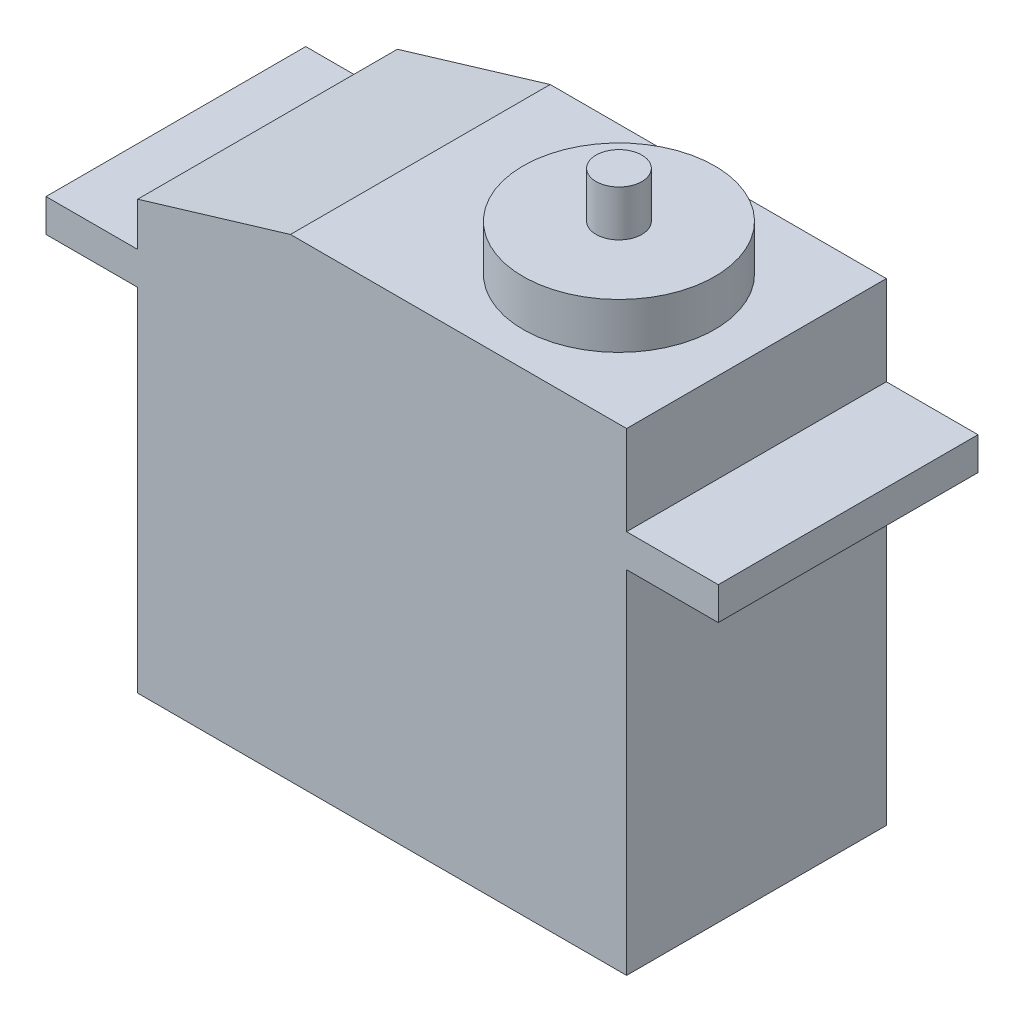
ISO-10303-21;
HEADER;
FILE_DESCRIPTION(('STEP AP214'),'2;1');
FILE_NAME('part.step','',(''),(''),'','','');
FILE_SCHEMA(('AUTOMOTIVE_DESIGN { 1 0 10303 214 1 1 1 1 }'));
ENDSEC;
DATA;
#1=APPLICATION_CONTEXT('core data for automotive mechanical design processes');
#2=APPLICATION_PROTOCOL_DEFINITION('international standard','automotive_design',2000,#1);
#3=PRODUCT_CONTEXT('',#1,'mechanical');
#4=PRODUCT('Part','Part','',(#3));
#5=PRODUCT_RELATED_PRODUCT_CATEGORY('part','',(#4));
#6=PRODUCT_DEFINITION_FORMATION('','',#4);
#7=PRODUCT_DEFINITION_CONTEXT('part definition',#1,'design');
#8=PRODUCT_DEFINITION('design','',#6,#7);
#9=PRODUCT_DEFINITION_SHAPE('','',#8);
#10=(LENGTH_UNIT() NAMED_UNIT(*) SI_UNIT(.MILLI.,.METRE.));
#11=(NAMED_UNIT(*) PLANE_ANGLE_UNIT() SI_UNIT($,.RADIAN.));
#12=(NAMED_UNIT(*) SI_UNIT($,.STERADIAN.) SOLID_ANGLE_UNIT());
#13=UNCERTAINTY_MEASURE_WITH_UNIT(LENGTH_MEASURE(1.E-05),#10,'distance_accuracy_value','');
#14=(GEOMETRIC_REPRESENTATION_CONTEXT(3) GLOBAL_UNCERTAINTY_ASSIGNED_CONTEXT((#13)) GLOBAL_UNIT_ASSIGNED_CONTEXT((#10,
#11,#12)) REPRESENTATION_CONTEXT('',''));
#15=CARTESIAN_POINT('',(0.,0.,0.));
#16=DIRECTION('',(0.,0.,1.));
#17=DIRECTION('',(1.,0.,0.));
#18=AXIS2_PLACEMENT_3D('',#15,#16,#17);
#19=CARTESIAN_POINT('',(16.,0.,-17.));
#20=DIRECTION('',(1.,0.,0.));
#21=DIRECTION('',(0.,0.,-1.));
#22=AXIS2_PLACEMENT_3D('',#19,#20,#21);
#23=PLANE('',#22);
#24=DIRECTION('',(0.,1.,0.));
#25=VECTOR('',#24,1.);
#26=CARTESIAN_POINT('',(16.,0.,-17.));
#27=LINE('',#26,#25);
#28=CARTESIAN_POINT('',(16.,-15.5,-17.));
#29=VERTEX_POINT('',#28);
#30=CARTESIAN_POINT('',(16.,7.5,-17.));
#31=VERTEX_POINT('',#30);
#32=EDGE_CURVE('E190',#29,#31,#27,.T.);
#33=ORIENTED_EDGE('',*,*,#32,.T.);
#34=DIRECTION('',(0.,0.,1.));
#35=VECTOR('',#34,1.);
#36=CARTESIAN_POINT('',(16.,7.5,-17.));
#37=LINE('',#36,#35);
#38=CARTESIAN_POINT('',(16.,7.5,0.));
#39=VERTEX_POINT('',#38);
#40=EDGE_CURVE('E166',#31,#39,#37,.T.);
#41=ORIENTED_EDGE('',*,*,#40,.T.);
#42=DIRECTION('',(0.,1.,0.));
#43=VECTOR('',#42,1.);
#44=CARTESIAN_POINT('',(16.,0.,0.));
#45=LINE('',#44,#43);
#46=CARTESIAN_POINT('',(16.,-15.5,0.));
#47=VERTEX_POINT('',#46);
#48=EDGE_CURVE('E204',#47,#39,#45,.T.);
#49=ORIENTED_EDGE('',*,*,#48,.F.);
#50=DIRECTION('',(0.,0.,1.));
#51=VECTOR('',#50,1.);
#52=CARTESIAN_POINT('',(16.,-15.5,-17.));
#53=LINE('',#52,#51);
#54=EDGE_CURVE('E215',#29,#47,#53,.T.);
#55=ORIENTED_EDGE('',*,*,#54,.F.);
#56=EDGE_LOOP('',(#33,#41,#49,#55));
#57=FACE_BOUND('',#56,.T.);
#58=ADVANCED_FACE('F39',(#57),#23,.T.);
#59=CARTESIAN_POINT('',(-16.,0.,-17.));
#60=DIRECTION('',(1.,0.,0.));
#61=DIRECTION('',(0.,0.,-1.));
#62=AXIS2_PLACEMENT_3D('',#59,#60,#61);
#63=PLANE('',#62);
#64=DIRECTION('',(0.,0.,1.));
#65=VECTOR('',#64,1.);
#66=CARTESIAN_POINT('',(-16.,7.5,-17.));
#67=LINE('',#66,#65);
#68=CARTESIAN_POINT('',(-16.,7.5,-17.));
#69=VERTEX_POINT('',#68);
#70=CARTESIAN_POINT('',(-16.,7.5,0.));
#71=VERTEX_POINT('',#70);
#72=EDGE_CURVE('E64',#69,#71,#67,.T.);
#73=ORIENTED_EDGE('',*,*,#72,.F.);
#74=DIRECTION('',(0.,1.,0.));
#75=VECTOR('',#74,1.);
#76=CARTESIAN_POINT('',(-16.,0.,-17.));
#77=LINE('',#76,#75);
#78=CARTESIAN_POINT('',(-16.,-15.5,-17.));
#79=VERTEX_POINT('',#78);
#80=EDGE_CURVE('E184',#79,#69,#77,.T.);
#81=ORIENTED_EDGE('',*,*,#80,.F.);
#82=DIRECTION('',(0.,0.,1.));
#83=VECTOR('',#82,1.);
#84=CARTESIAN_POINT('',(-16.,-15.5,-17.));
#85=LINE('',#84,#83);
#86=CARTESIAN_POINT('',(-16.,-15.5,0.));
#87=VERTEX_POINT('',#86);
#88=EDGE_CURVE('E216',#79,#87,#85,.T.);
#89=ORIENTED_EDGE('',*,*,#88,.T.);
#90=DIRECTION('',(0.,1.,0.));
#91=VECTOR('',#90,1.);
#92=CARTESIAN_POINT('',(-16.,0.,0.));
#93=LINE('',#92,#91);
#94=EDGE_CURVE('E198',#87,#71,#93,.T.);
#95=ORIENTED_EDGE('',*,*,#94,.T.);
#96=EDGE_LOOP('',(#73,#81,#89,#95));
#97=FACE_BOUND('',#96,.T.);
#98=ADVANCED_FACE('F279',(#97),#63,.F.);
#99=CARTESIAN_POINT('',(-4.76146788990826,15.8715596330275,-17.));
#100=DIRECTION('',(0.287347885566345,-0.957826285221151,0.));
#101=DIRECTION('',(0.957826285221151,0.287347885566345,0.));
#102=AXIS2_PLACEMENT_3D('',#99,#100,#101);
#103=PLANE('',#102);
#104=DIRECTION('',(0.957826285221151,0.287347885566345,0.));
#105=VECTOR('',#104,1.);
#106=CARTESIAN_POINT('',(-4.76146788990826,15.8715596330275,0.));
#107=LINE('',#106,#105);
#108=CARTESIAN_POINT('',(-16.,12.5,0.));
#109=VERTEX_POINT('',#108);
#110=CARTESIAN_POINT('',(-6.,15.5,0.));
#111=VERTEX_POINT('',#110);
#112=EDGE_CURVE('E179',#109,#111,#107,.T.);
#113=ORIENTED_EDGE('',*,*,#112,.T.);
#114=DIRECTION('',(0.,0.,1.));
#115=VECTOR('',#114,1.);
#116=CARTESIAN_POINT('',(-6.,15.5,-17.));
#117=LINE('',#116,#115);
#118=CARTESIAN_POINT('',(-6.,15.5,-17.));
#119=VERTEX_POINT('',#118);
#120=EDGE_CURVE('E209',#119,#111,#117,.T.);
#121=ORIENTED_EDGE('',*,*,#120,.F.);
#122=DIRECTION('',(0.957826285221151,0.287347885566345,0.));
#123=VECTOR('',#122,1.);
#124=CARTESIAN_POINT('',(-4.76146788990826,15.8715596330275,-17.));
#125=LINE('',#124,#123);
#126=CARTESIAN_POINT('',(-16.,12.5,-17.));
#127=VERTEX_POINT('',#126);
#128=EDGE_CURVE('E180',#127,#119,#125,.T.);
#129=ORIENTED_EDGE('',*,*,#128,.F.);
#130=DIRECTION('',(0.,0.,1.));
#131=VECTOR('',#130,1.);
#132=CARTESIAN_POINT('',(-16.,12.5,-17.));
#133=LINE('',#132,#131);
#134=EDGE_CURVE('E43',#127,#109,#133,.T.);
#135=ORIENTED_EDGE('',*,*,#134,.T.);
#136=EDGE_LOOP('',(#113,#121,#129,#135));
#137=FACE_BOUND('',#136,.T.);
#138=ADVANCED_FACE('F41',(#137),#103,.F.);
#139=CARTESIAN_POINT('',(0.,15.5,-17.));
#140=DIRECTION('',(0.,-1.,0.));
#141=DIRECTION('',(1.,0.,0.));
#142=AXIS2_PLACEMENT_3D('',#139,#140,#141);
#143=PLANE('',#142);
#144=CARTESIAN_POINT('',(7.00000000000001,15.5,-8.5));
#145=DIRECTION('',(0.,1.,0.));
#146=DIRECTION('',(-1.,0.,0.));
#147=AXIS2_PLACEMENT_3D('',#144,#145,#146);
#148=CIRCLE('',#147,6.275);
#149=CARTESIAN_POINT('',(0.725000000000003,15.5,-8.5));
#150=VERTEX_POINT('',#149);
#151=EDGE_CURVE('E48',#150,#150,#148,.T.);
#152=ORIENTED_EDGE('',*,*,#151,.F.);
#153=EDGE_LOOP('',(#152));
#154=FACE_BOUND('',#153,.T.);
#155=DIRECTION('',(1.,0.,0.));
#156=VECTOR('',#155,1.);
#157=CARTESIAN_POINT('',(0.,15.5,0.));
#158=LINE('',#157,#156);
#159=CARTESIAN_POINT('',(16.,15.5,0.));
#160=VERTEX_POINT('',#159);
#161=EDGE_CURVE('E183',#111,#160,#158,.T.);
#162=ORIENTED_EDGE('',*,*,#161,.T.);
#163=DIRECTION('',(0.,0.,1.));
#164=VECTOR('',#163,1.);
#165=CARTESIAN_POINT('',(16.,15.5,-17.));
#166=LINE('',#165,#164);
#167=CARTESIAN_POINT('',(16.,15.5,-17.));
#168=VERTEX_POINT('',#167);
#169=EDGE_CURVE('E212',#168,#160,#166,.T.);
#170=ORIENTED_EDGE('',*,*,#169,.F.);
#171=DIRECTION('',(1.,0.,0.));
#172=VECTOR('',#171,1.);
#173=CARTESIAN_POINT('',(0.,15.5,-17.));
#174=LINE('',#173,#172);
#175=EDGE_CURVE('E193',#119,#168,#174,.T.);
#176=ORIENTED_EDGE('',*,*,#175,.F.);
#177=ORIENTED_EDGE('',*,*,#120,.T.);
#178=EDGE_LOOP('',(#162,#170,#176,#177));
#179=FACE_BOUND('',#178,.T.);
#180=ADVANCED_FACE('F226',(#154,#179),#143,.F.);
#181=DIRECTION('',(0.,0.,1.));
#182=VECTOR('',#181,1.);
#183=CARTESIAN_POINT('',(16.,9.65,-17.));
#184=LINE('',#183,#182);
#185=CARTESIAN_POINT('',(16.,9.65,-17.));
#186=VERTEX_POINT('',#185);
#187=CARTESIAN_POINT('',(16.,9.65,0.));
#188=VERTEX_POINT('',#187);
#189=EDGE_CURVE('E177',#186,#188,#184,.T.);
#190=ORIENTED_EDGE('',*,*,#189,.F.);
#191=EDGE_CURVE('E189',#186,#168,#27,.T.);
#192=ORIENTED_EDGE('',*,*,#191,.T.);
#193=ORIENTED_EDGE('',*,*,#169,.T.);
#194=EDGE_CURVE('E203',#188,#160,#45,.T.);
#195=ORIENTED_EDGE('',*,*,#194,.F.);
#196=EDGE_LOOP('',(#190,#192,#193,#195));
#197=FACE_BOUND('',#196,.T.);
#198=ADVANCED_FACE('F281',(#197),#23,.T.);
#199=CARTESIAN_POINT('',(0.,-15.5,-17.));
#200=DIRECTION('',(0.,-1.,0.));
#201=DIRECTION('',(0.,0.,-1.));
#202=AXIS2_PLACEMENT_3D('',#199,#200,#201);
#203=PLANE('',#202);
#204=DIRECTION('',(1.,0.,0.));
#205=VECTOR('',#204,1.);
#206=CARTESIAN_POINT('',(0.,-15.5,0.));
#207=LINE('',#206,#205);
#208=EDGE_CURVE('E200',#87,#47,#207,.T.);
#209=ORIENTED_EDGE('',*,*,#208,.F.);
#210=ORIENTED_EDGE('',*,*,#88,.F.);
#211=DIRECTION('',(1.,0.,0.));
#212=VECTOR('',#211,1.);
#213=CARTESIAN_POINT('',(0.,-15.5,-17.));
#214=LINE('',#213,#212);
#215=EDGE_CURVE('E186',#79,#29,#214,.T.);
#216=ORIENTED_EDGE('',*,*,#215,.T.);
#217=ORIENTED_EDGE('',*,*,#54,.T.);
#218=EDGE_LOOP('',(#209,#210,#216,#217));
#219=FACE_BOUND('',#218,.T.);
#220=ADVANCED_FACE('F260',(#219),#203,.T.);
#221=CARTESIAN_POINT('',(-16.,9.65,-17.));
#222=VERTEX_POINT('',#221);
#223=EDGE_CURVE('E56',#222,#127,#77,.T.);
#224=ORIENTED_EDGE('',*,*,#223,.F.);
#225=DIRECTION('',(0.,0.,1.));
#226=VECTOR('',#225,1.);
#227=CARTESIAN_POINT('',(-16.,9.65,-17.));
#228=LINE('',#227,#226);
#229=CARTESIAN_POINT('',(-16.,9.65,0.));
#230=VERTEX_POINT('',#229);
#231=EDGE_CURVE('E175',#222,#230,#228,.T.);
#232=ORIENTED_EDGE('',*,*,#231,.T.);
#233=EDGE_CURVE('E146',#230,#109,#93,.T.);
#234=ORIENTED_EDGE('',*,*,#233,.T.);
#235=ORIENTED_EDGE('',*,*,#134,.F.);
#236=EDGE_LOOP('',(#224,#232,#234,#235));
#237=FACE_BOUND('',#236,.T.);
#238=ADVANCED_FACE('F285',(#237),#63,.F.);
#239=CARTESIAN_POINT('',(0.,0.,-17.));
#240=DIRECTION('',(0.,0.,1.));
#241=DIRECTION('',(1.,0.,0.));
#242=AXIS2_PLACEMENT_3D('',#239,#240,#241);
#243=PLANE('',#242);
#244=ORIENTED_EDGE('',*,*,#191,.F.);
#245=DIRECTION('',(-1.,0.,0.));
#246=VECTOR('',#245,1.);
#247=CARTESIAN_POINT('',(-22.,9.65,-17.));
#248=LINE('',#247,#246);
#249=CARTESIAN_POINT('',(22.,9.65,-17.));
#250=VERTEX_POINT('',#249);
#251=EDGE_CURVE('E231',#250,#186,#248,.T.);
#252=ORIENTED_EDGE('',*,*,#251,.F.);
#253=DIRECTION('',(0.,-1.,0.));
#254=VECTOR('',#253,1.);
#255=CARTESIAN_POINT('',(22.,9.65,-17.));
#256=LINE('',#255,#254);
#257=CARTESIAN_POINT('',(22.,7.5,-17.));
#258=VERTEX_POINT('',#257);
#259=EDGE_CURVE('E169',#250,#258,#256,.T.);
#260=ORIENTED_EDGE('',*,*,#259,.T.);
#261=DIRECTION('',(-1.,0.,0.));
#262=VECTOR('',#261,1.);
#263=CARTESIAN_POINT('',(-22.,7.5,-17.));
#264=LINE('',#263,#262);
#265=EDGE_CURVE('E159',#258,#31,#264,.T.);
#266=ORIENTED_EDGE('',*,*,#265,.T.);
#267=ORIENTED_EDGE('',*,*,#32,.F.);
#268=ORIENTED_EDGE('',*,*,#215,.F.);
#269=ORIENTED_EDGE('',*,*,#80,.T.);
#270=CARTESIAN_POINT('',(-22.,7.5,-17.));
#271=VERTEX_POINT('',#270);
#272=EDGE_CURVE('E242',#69,#271,#264,.T.);
#273=ORIENTED_EDGE('',*,*,#272,.T.);
#274=DIRECTION('',(0.,-1.,0.));
#275=VECTOR('',#274,1.);
#276=CARTESIAN_POINT('',(-22.,9.65,-17.));
#277=LINE('',#276,#275);
#278=CARTESIAN_POINT('',(-22.,9.65,-17.));
#279=VERTEX_POINT('',#278);
#280=EDGE_CURVE('E230',#279,#271,#277,.T.);
#281=ORIENTED_EDGE('',*,*,#280,.F.);
#282=EDGE_CURVE('E155',#222,#279,#248,.T.);
#283=ORIENTED_EDGE('',*,*,#282,.F.);
#284=ORIENTED_EDGE('',*,*,#223,.T.);
#285=ORIENTED_EDGE('',*,*,#128,.T.);
#286=ORIENTED_EDGE('',*,*,#175,.T.);
#287=EDGE_LOOP('',(#244,#252,#260,#266,#267,#268,#269,#273,#281,#283,#284,#285,#286));
#288=FACE_BOUND('',#287,.T.);
#289=ADVANCED_FACE('F229',(#288),#243,.F.);
#290=CARTESIAN_POINT('',(0.,0.,0.));
#291=DIRECTION('',(0.,0.,1.));
#292=DIRECTION('',(1.,0.,0.));
#293=AXIS2_PLACEMENT_3D('',#290,#291,#292);
#294=PLANE('',#293);
#295=ORIENTED_EDGE('',*,*,#233,.F.);
#296=DIRECTION('',(1.,0.,0.));
#297=VECTOR('',#296,1.);
#298=CARTESIAN_POINT('',(-22.,9.65,0.));
#299=LINE('',#298,#297);
#300=CARTESIAN_POINT('',(-22.,9.65,0.));
#301=VERTEX_POINT('',#300);
#302=EDGE_CURVE('E138',#301,#230,#299,.T.);
#303=ORIENTED_EDGE('',*,*,#302,.F.);
#304=DIRECTION('',(0.,-1.,0.));
#305=VECTOR('',#304,1.);
#306=CARTESIAN_POINT('',(-22.,9.65,0.));
#307=LINE('',#306,#305);
#308=CARTESIAN_POINT('',(-22.,7.5,0.));
#309=VERTEX_POINT('',#308);
#310=EDGE_CURVE('E143',#301,#309,#307,.T.);
#311=ORIENTED_EDGE('',*,*,#310,.T.);
#312=DIRECTION('',(1.,0.,0.));
#313=VECTOR('',#312,1.);
#314=CARTESIAN_POINT('',(-22.,7.5,0.));
#315=LINE('',#314,#313);
#316=EDGE_CURVE('E238',#309,#71,#315,.T.);
#317=ORIENTED_EDGE('',*,*,#316,.T.);
#318=ORIENTED_EDGE('',*,*,#94,.F.);
#319=ORIENTED_EDGE('',*,*,#208,.T.);
#320=ORIENTED_EDGE('',*,*,#48,.T.);
#321=CARTESIAN_POINT('',(22.,7.5,0.));
#322=VERTEX_POINT('',#321);
#323=EDGE_CURVE('E236',#39,#322,#315,.T.);
#324=ORIENTED_EDGE('',*,*,#323,.T.);
#325=DIRECTION('',(0.,-1.,0.));
#326=VECTOR('',#325,1.);
#327=CARTESIAN_POINT('',(22.,9.65,0.));
#328=LINE('',#327,#326);
#329=CARTESIAN_POINT('',(22.,9.65,0.));
#330=VERTEX_POINT('',#329);
#331=EDGE_CURVE('E164',#330,#322,#328,.T.);
#332=ORIENTED_EDGE('',*,*,#331,.F.);
#333=EDGE_CURVE('E149',#188,#330,#299,.T.);
#334=ORIENTED_EDGE('',*,*,#333,.F.);
#335=ORIENTED_EDGE('',*,*,#194,.T.);
#336=ORIENTED_EDGE('',*,*,#161,.F.);
#337=ORIENTED_EDGE('',*,*,#112,.F.);
#338=EDGE_LOOP('',(#295,#303,#311,#317,#318,#319,#320,#324,#332,#334,#335,#336,#337));
#339=FACE_BOUND('',#338,.T.);
#340=ADVANCED_FACE('F140',(#339),#294,.T.);
#341=CARTESIAN_POINT('',(-22.,9.65,-17.));
#342=DIRECTION('',(1.,0.,0.));
#343=DIRECTION('',(0.,0.,-1.));
#344=AXIS2_PLACEMENT_3D('',#341,#342,#343);
#345=PLANE('',#344);
#346=DIRECTION('',(0.,0.,1.));
#347=VECTOR('',#346,1.);
#348=CARTESIAN_POINT('',(-22.,7.5,-17.));
#349=LINE('',#348,#347);
#350=EDGE_CURVE('E163',#271,#309,#349,.T.);
#351=ORIENTED_EDGE('',*,*,#350,.T.);
#352=ORIENTED_EDGE('',*,*,#310,.F.);
#353=DIRECTION('',(0.,0.,1.));
#354=VECTOR('',#353,1.);
#355=CARTESIAN_POINT('',(-22.,9.65,-17.));
#356=LINE('',#355,#354);
#357=EDGE_CURVE('E152',#279,#301,#356,.T.);
#358=ORIENTED_EDGE('',*,*,#357,.F.);
#359=ORIENTED_EDGE('',*,*,#280,.T.);
#360=EDGE_LOOP('',(#351,#352,#358,#359));
#361=FACE_BOUND('',#360,.T.);
#362=ADVANCED_FACE('F161',(#361),#345,.F.);
#363=CARTESIAN_POINT('',(0.,7.5,0.));
#364=DIRECTION('',(0.,1.,0.));
#365=DIRECTION('',(-1.,0.,0.));
#366=AXIS2_PLACEMENT_3D('',#363,#364,#365);
#367=PLANE('',#366);
#368=ORIENTED_EDGE('',*,*,#272,.F.);
#369=ORIENTED_EDGE('',*,*,#72,.T.);
#370=ORIENTED_EDGE('',*,*,#316,.F.);
#371=ORIENTED_EDGE('',*,*,#350,.F.);
#372=EDGE_LOOP('',(#368,#369,#370,#371));
#373=FACE_BOUND('',#372,.T.);
#374=ADVANCED_FACE('F264',(#373),#367,.F.);
#375=CARTESIAN_POINT('',(0.,9.65,0.));
#376=DIRECTION('',(0.,1.,0.));
#377=DIRECTION('',(-1.,0.,0.));
#378=AXIS2_PLACEMENT_3D('',#375,#376,#377);
#379=PLANE('',#378);
#380=ORIENTED_EDGE('',*,*,#231,.F.);
#381=ORIENTED_EDGE('',*,*,#282,.T.);
#382=ORIENTED_EDGE('',*,*,#357,.T.);
#383=ORIENTED_EDGE('',*,*,#302,.T.);
#384=EDGE_LOOP('',(#380,#381,#382,#383));
#385=FACE_BOUND('',#384,.T.);
#386=ADVANCED_FACE('F153',(#385),#379,.T.);
#387=CARTESIAN_POINT('',(22.,9.65,-17.));
#388=DIRECTION('',(-1.,0.,0.));
#389=DIRECTION('',(0.,-1.,0.));
#390=AXIS2_PLACEMENT_3D('',#387,#388,#389);
#391=PLANE('',#390);
#392=DIRECTION('',(0.,0.,-1.));
#393=VECTOR('',#392,1.);
#394=CARTESIAN_POINT('',(22.,7.5,-17.));
#395=LINE('',#394,#393);
#396=EDGE_CURVE('E240',#322,#258,#395,.T.);
#397=ORIENTED_EDGE('',*,*,#396,.T.);
#398=ORIENTED_EDGE('',*,*,#259,.F.);
#399=DIRECTION('',(0.,0.,-1.));
#400=VECTOR('',#399,1.);
#401=CARTESIAN_POINT('',(22.,9.65,-17.));
#402=LINE('',#401,#400);
#403=EDGE_CURVE('E148',#330,#250,#402,.T.);
#404=ORIENTED_EDGE('',*,*,#403,.F.);
#405=ORIENTED_EDGE('',*,*,#331,.T.);
#406=EDGE_LOOP('',(#397,#398,#404,#405));
#407=FACE_BOUND('',#406,.T.);
#408=ADVANCED_FACE('F271',(#407),#391,.F.);
#409=ORIENTED_EDGE('',*,*,#251,.T.);
#410=ORIENTED_EDGE('',*,*,#189,.T.);
#411=ORIENTED_EDGE('',*,*,#333,.T.);
#412=ORIENTED_EDGE('',*,*,#403,.T.);
#413=EDGE_LOOP('',(#409,#410,#411,#412));
#414=FACE_BOUND('',#413,.T.);
#415=ADVANCED_FACE('F273',(#414),#379,.T.);
#416=ORIENTED_EDGE('',*,*,#40,.F.);
#417=ORIENTED_EDGE('',*,*,#265,.F.);
#418=ORIENTED_EDGE('',*,*,#396,.F.);
#419=ORIENTED_EDGE('',*,*,#323,.F.);
#420=EDGE_LOOP('',(#416,#417,#418,#419));
#421=FACE_BOUND('',#420,.T.);
#422=ADVANCED_FACE('F254',(#421),#367,.F.);
#423=CARTESIAN_POINT('',(7.00000000000001,18.5,-8.5));
#424=DIRECTION('',(0.,-1.,0.));
#425=DIRECTION('',(1.,0.,0.));
#426=AXIS2_PLACEMENT_3D('',#423,#424,#425);
#427=CYLINDRICAL_SURFACE('',#426,6.275);
#428=CARTESIAN_POINT('',(7.00000000000001,18.5,-8.5));
#429=DIRECTION('',(0.,1.,0.));
#430=DIRECTION('',(-1.,0.,0.));
#431=AXIS2_PLACEMENT_3D('',#428,#429,#430);
#432=CIRCLE('',#431,6.275);
#433=CARTESIAN_POINT('',(0.725000000000003,18.5,-8.5));
#434=VERTEX_POINT('',#433);
#435=EDGE_CURVE('E237',#434,#434,#432,.T.);
#436=ORIENTED_EDGE('',*,*,#435,.F.);
#437=EDGE_LOOP('',(#436));
#438=FACE_BOUND('',#437,.T.);
#439=ORIENTED_EDGE('',*,*,#151,.T.);
#440=EDGE_LOOP('',(#439));
#441=FACE_BOUND('',#440,.T.);
#442=ADVANCED_FACE('F277',(#438,#441),#427,.T.);
#443=CARTESIAN_POINT('',(7.00000000000001,18.5,-8.5));
#444=DIRECTION('',(0.,1.,0.));
#445=DIRECTION('',(-1.,0.,0.));
#446=AXIS2_PLACEMENT_3D('',#443,#444,#445);
#447=PLANE('',#446);
#448=CARTESIAN_POINT('',(7.00000000000001,18.5,-8.5));
#449=DIRECTION('',(0.,1.,0.));
#450=DIRECTION('',(-1.,0.,0.));
#451=AXIS2_PLACEMENT_3D('',#448,#449,#450);
#452=CIRCLE('',#451,1.5);
#453=CARTESIAN_POINT('',(5.50000000000001,18.5,-8.5));
#454=VERTEX_POINT('',#453);
#455=EDGE_CURVE('E11',#454,#454,#452,.T.);
#456=ORIENTED_EDGE('',*,*,#455,.F.);
#457=EDGE_LOOP('',(#456));
#458=FACE_BOUND('',#457,.T.);
#459=ORIENTED_EDGE('',*,*,#435,.T.);
#460=EDGE_LOOP('',(#459));
#461=FACE_BOUND('',#460,.T.);
#462=ADVANCED_FACE('F311',(#458,#461),#447,.T.);
#463=CARTESIAN_POINT('',(7.00000000000001,21.5,-8.5));
#464=DIRECTION('',(0.,-1.,0.));
#465=DIRECTION('',(1.,0.,0.));
#466=AXIS2_PLACEMENT_3D('',#463,#464,#465);
#467=CYLINDRICAL_SURFACE('',#466,1.5);
#468=CARTESIAN_POINT('',(7.00000000000001,21.5,-8.5));
#469=DIRECTION('',(0.,1.,0.));
#470=DIRECTION('',(-1.,0.,0.));
#471=AXIS2_PLACEMENT_3D('',#468,#469,#470);
#472=CIRCLE('',#471,1.5);
#473=CARTESIAN_POINT('',(5.50000000000001,21.5,-8.5));
#474=VERTEX_POINT('',#473);
#475=EDGE_CURVE('E301',#474,#474,#472,.T.);
#476=ORIENTED_EDGE('',*,*,#475,.F.);
#477=EDGE_LOOP('',(#476));
#478=FACE_BOUND('',#477,.T.);
#479=ORIENTED_EDGE('',*,*,#455,.T.);
#480=EDGE_LOOP('',(#479));
#481=FACE_BOUND('',#480,.T.);
#482=ADVANCED_FACE('F308',(#478,#481),#467,.T.);
#483=CARTESIAN_POINT('',(7.00000000000001,21.5,-8.5));
#484=DIRECTION('',(0.,1.,0.));
#485=DIRECTION('',(-1.,0.,0.));
#486=AXIS2_PLACEMENT_3D('',#483,#484,#485);
#487=PLANE('',#486);
#488=ORIENTED_EDGE('',*,*,#475,.T.);
#489=EDGE_LOOP('',(#488));
#490=FACE_BOUND('',#489,.T.);
#491=ADVANCED_FACE('F306',(#490),#487,.T.);
#492=CLOSED_SHELL('',(#58,#98,#138,#180,#198,#220,#238,#289,#340,#362,#374,#386,#408,#415,#422,
#442,#462,#482,#491));
#493=MANIFOLD_SOLID_BREP('B2',#492);
#494=ADVANCED_BREP_SHAPE_REPRESENTATION('',(#18,#493),#14);
#495=SHAPE_DEFINITION_REPRESENTATION(#9,#494);
ENDSEC;
END-ISO-10303-21;
